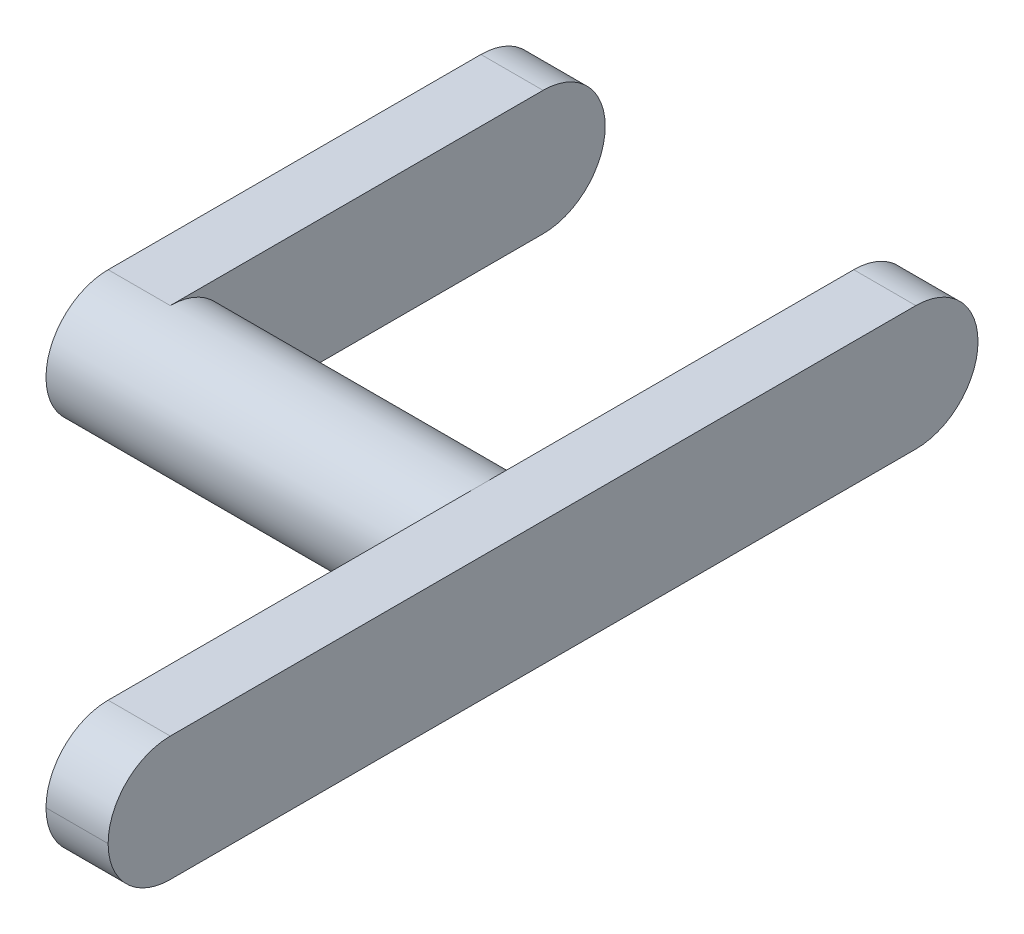
ISO-10303-21;
HEADER;
FILE_DESCRIPTION(('STEP AP214'),'2;1');
FILE_NAME('part.step','',(''),(''),'','','');
FILE_SCHEMA(('AUTOMOTIVE_DESIGN { 1 0 10303 214 1 1 1 1 }'));
ENDSEC;
DATA;
#1=APPLICATION_CONTEXT('core data for automotive mechanical design processes');
#2=APPLICATION_PROTOCOL_DEFINITION('international standard','automotive_design',2000,#1);
#3=PRODUCT_CONTEXT('',#1,'mechanical');
#4=PRODUCT('Part','Part','',(#3));
#5=PRODUCT_RELATED_PRODUCT_CATEGORY('part','',(#4));
#6=PRODUCT_DEFINITION_FORMATION('','',#4);
#7=PRODUCT_DEFINITION_CONTEXT('part definition',#1,'design');
#8=PRODUCT_DEFINITION('design','',#6,#7);
#9=PRODUCT_DEFINITION_SHAPE('','',#8);
#10=(LENGTH_UNIT() NAMED_UNIT(*) SI_UNIT(.MILLI.,.METRE.));
#11=(NAMED_UNIT(*) PLANE_ANGLE_UNIT() SI_UNIT($,.RADIAN.));
#12=(NAMED_UNIT(*) SI_UNIT($,.STERADIAN.) SOLID_ANGLE_UNIT());
#13=UNCERTAINTY_MEASURE_WITH_UNIT(LENGTH_MEASURE(1.E-05),#10,'distance_accuracy_value','');
#14=(GEOMETRIC_REPRESENTATION_CONTEXT(3) GLOBAL_UNCERTAINTY_ASSIGNED_CONTEXT((#13)) GLOBAL_UNIT_ASSIGNED_CONTEXT((#10,
#11,#12)) REPRESENTATION_CONTEXT('',''));
#15=CARTESIAN_POINT('',(0.,0.,0.));
#16=DIRECTION('',(0.,0.,1.));
#17=DIRECTION('',(1.,0.,0.));
#18=AXIS2_PLACEMENT_3D('',#15,#16,#17);
#19=CARTESIAN_POINT('',(0.,10.,0.));
#20=DIRECTION('',(1.,0.,0.));
#21=DIRECTION('',(0.,0.,-1.));
#22=AXIS2_PLACEMENT_3D('',#19,#20,#21);
#23=PLANE('',#22);
#24=CARTESIAN_POINT('',(0.,5.,-65.));
#25=DIRECTION('',(1.,0.,0.));
#26=DIRECTION('',(0.,0.,-1.));
#27=AXIS2_PLACEMENT_3D('',#24,#25,#26);
#28=CIRCLE('',#27,5.);
#29=CARTESIAN_POINT('',(0.,10.,-65.));
#30=VERTEX_POINT('',#29);
#31=CARTESIAN_POINT('',(0.,5.,-70.));
#32=VERTEX_POINT('',#31);
#33=EDGE_CURVE('E224',#30,#32,#28,.F.);
#34=ORIENTED_EDGE('',*,*,#33,.T.);
#35=CARTESIAN_POINT('',(0.,5.,-65.));
#36=DIRECTION('',(1.,0.,0.));
#37=DIRECTION('',(0.,0.,-1.));
#38=AXIS2_PLACEMENT_3D('',#35,#36,#37);
#39=CIRCLE('',#38,5.);
#40=CARTESIAN_POINT('',(0.,0.,-65.));
#41=VERTEX_POINT('',#40);
#42=EDGE_CURVE('E226',#32,#41,#39,.F.);
#43=ORIENTED_EDGE('',*,*,#42,.T.);
#44=DIRECTION('',(0.,0.,1.));
#45=VECTOR('',#44,1.);
#46=CARTESIAN_POINT('',(0.,0.,0.));
#47=LINE('',#46,#45);
#48=CARTESIAN_POINT('',(0.,0.,-35.));
#49=VERTEX_POINT('',#48);
#50=EDGE_CURVE('E219',#41,#49,#47,.T.);
#51=ORIENTED_EDGE('',*,*,#50,.T.);
#52=CARTESIAN_POINT('',(0.,5.,-35.));
#53=DIRECTION('',(-1.,0.,0.));
#54=DIRECTION('',(0.,0.,1.));
#55=AXIS2_PLACEMENT_3D('',#52,#53,#54);
#56=CIRCLE('',#55,5.);
#57=CARTESIAN_POINT('',(0.,10.,-35.));
#58=VERTEX_POINT('',#57);
#59=EDGE_CURVE('E177',#58,#49,#56,.T.);
#60=ORIENTED_EDGE('',*,*,#59,.F.);
#61=DIRECTION('',(0.,0.,1.));
#62=VECTOR('',#61,1.);
#63=CARTESIAN_POINT('',(0.,10.,0.));
#64=LINE('',#63,#62);
#65=EDGE_CURVE('E213',#30,#58,#64,.T.);
#66=ORIENTED_EDGE('',*,*,#65,.F.);
#67=EDGE_LOOP('',(#34,#43,#51,#60,#66));
#68=FACE_BOUND('',#67,.T.);
#69=ADVANCED_FACE('F35',(#68),#23,.F.);
#70=CARTESIAN_POINT('',(0.,0.,-5.));
#71=VERTEX_POINT('',#70);
#72=EDGE_CURVE('E206',#49,#71,#47,.T.);
#73=ORIENTED_EDGE('',*,*,#72,.T.);
#74=CARTESIAN_POINT('',(0.,5.,-5.));
#75=DIRECTION('',(1.,0.,0.));
#76=DIRECTION('',(0.,0.,-1.));
#77=AXIS2_PLACEMENT_3D('',#74,#75,#76);
#78=CIRCLE('',#77,5.);
#79=CARTESIAN_POINT('',(0.,5.,0.));
#80=VERTEX_POINT('',#79);
#81=EDGE_CURVE('E243',#71,#80,#78,.F.);
#82=ORIENTED_EDGE('',*,*,#81,.T.);
#83=CARTESIAN_POINT('',(0.,5.,-5.));
#84=DIRECTION('',(1.,0.,0.));
#85=DIRECTION('',(0.,0.,-1.));
#86=AXIS2_PLACEMENT_3D('',#83,#84,#85);
#87=CIRCLE('',#86,5.);
#88=CARTESIAN_POINT('',(0.,10.,-5.));
#89=VERTEX_POINT('',#88);
#90=EDGE_CURVE('E60',#80,#89,#87,.F.);
#91=ORIENTED_EDGE('',*,*,#90,.T.);
#92=EDGE_CURVE('E216',#58,#89,#64,.T.);
#93=ORIENTED_EDGE('',*,*,#92,.F.);
#94=EDGE_CURVE('E180',#49,#58,#56,.T.);
#95=ORIENTED_EDGE('',*,*,#94,.F.);
#96=EDGE_LOOP('',(#73,#82,#91,#93,#95));
#97=FACE_BOUND('',#96,.T.);
#98=DIRECTION('',(0.,-0.087295850286759,-0.99618243034231));
#99=VECTOR('',#98,1.);
#100=CARTESIAN_POINT('',(0.,8.88334864029896,-0.778451264877408));
#101=LINE('',#100,#99);
#102=CARTESIAN_POINT('',(0.,8.48663850619809,-5.30553547600365));
#103=VERTEX_POINT('',#102);
#104=CARTESIAN_POINT('',(0.,7.89999999999999,-12.));
#105=VERTEX_POINT('',#104);
#106=EDGE_CURVE('E196',#103,#105,#101,.T.);
#107=ORIENTED_EDGE('',*,*,#106,.F.);
#108=CARTESIAN_POINT('',(0.,5.,-5.));
#109=DIRECTION('',(-1.,0.,0.));
#110=DIRECTION('',(0.,0.,1.));
#111=AXIS2_PLACEMENT_3D('',#108,#109,#110);
#112=CIRCLE('',#111,3.5);
#113=CARTESIAN_POINT('',(0.,1.51336149380191,-5.30553547600364));
#114=VERTEX_POINT('',#113);
#115=EDGE_CURVE('E176',#114,#103,#112,.T.);
#116=ORIENTED_EDGE('',*,*,#115,.F.);
#117=DIRECTION('',(0.,-0.0872958502867559,0.99618243034231));
#118=VECTOR('',#117,1.);
#119=CARTESIAN_POINT('',(0.,1.04044570492818,0.0911746580972107));
#120=LINE('',#119,#118);
#121=CARTESIAN_POINT('',(0.,2.09999999999999,-12.));
#122=VERTEX_POINT('',#121);
#123=EDGE_CURVE('E185',#122,#114,#120,.T.);
#124=ORIENTED_EDGE('',*,*,#123,.F.);
#125=DIRECTION('',(0.,-1.,0.));
#126=VECTOR('',#125,1.);
#127=CARTESIAN_POINT('',(0.,0.,-12.));
#128=LINE('',#127,#126);
#129=EDGE_CURVE('E199',#105,#122,#128,.T.);
#130=ORIENTED_EDGE('',*,*,#129,.F.);
#131=EDGE_LOOP('',(#107,#116,#124,#130));
#132=FACE_BOUND('',#131,.T.);
#133=ADVANCED_FACE('F276',(#97,#132),#23,.F.);
#134=CARTESIAN_POINT('',(5.,10.,0.));
#135=DIRECTION('',(-1.,0.,0.));
#136=DIRECTION('',(0.,0.,1.));
#137=AXIS2_PLACEMENT_3D('',#134,#135,#136);
#138=PLANE('',#137);
#139=CARTESIAN_POINT('',(5.,5.,-5.));
#140=DIRECTION('',(-1.,0.,0.));
#141=DIRECTION('',(0.,0.,1.));
#142=AXIS2_PLACEMENT_3D('',#139,#140,#141);
#143=CIRCLE('',#142,5.);
#144=CARTESIAN_POINT('',(5.,10.,-5.));
#145=VERTEX_POINT('',#144);
#146=CARTESIAN_POINT('',(5.,5.,0.));
#147=VERTEX_POINT('',#146);
#148=EDGE_CURVE('E238',#145,#147,#143,.F.);
#149=ORIENTED_EDGE('',*,*,#148,.T.);
#150=CARTESIAN_POINT('',(5.,5.,-5.));
#151=DIRECTION('',(-1.,0.,0.));
#152=DIRECTION('',(0.,0.,1.));
#153=AXIS2_PLACEMENT_3D('',#150,#151,#152);
#154=CIRCLE('',#153,5.);
#155=CARTESIAN_POINT('',(5.,0.,-5.));
#156=VERTEX_POINT('',#155);
#157=EDGE_CURVE('E240',#147,#156,#154,.F.);
#158=ORIENTED_EDGE('',*,*,#157,.T.);
#159=DIRECTION('',(0.,0.,-1.));
#160=VECTOR('',#159,1.);
#161=CARTESIAN_POINT('',(5.,0.,0.));
#162=LINE('',#161,#160);
#163=CARTESIAN_POINT('',(5.,0.,-65.));
#164=VERTEX_POINT('',#163);
#165=EDGE_CURVE('E221',#156,#164,#162,.T.);
#166=ORIENTED_EDGE('',*,*,#165,.T.);
#167=CARTESIAN_POINT('',(5.,5.,-65.));
#168=DIRECTION('',(-1.,0.,0.));
#169=DIRECTION('',(0.,0.,1.));
#170=AXIS2_PLACEMENT_3D('',#167,#168,#169);
#171=CIRCLE('',#170,5.);
#172=CARTESIAN_POINT('',(5.,5.,-70.));
#173=VERTEX_POINT('',#172);
#174=EDGE_CURVE('E236',#164,#173,#171,.F.);
#175=ORIENTED_EDGE('',*,*,#174,.T.);
#176=CARTESIAN_POINT('',(5.,5.,-65.));
#177=DIRECTION('',(-1.,0.,0.));
#178=DIRECTION('',(0.,0.,1.));
#179=AXIS2_PLACEMENT_3D('',#176,#177,#178);
#180=CIRCLE('',#179,5.);
#181=CARTESIAN_POINT('',(5.,10.,-65.));
#182=VERTEX_POINT('',#181);
#183=EDGE_CURVE('E234',#173,#182,#180,.F.);
#184=ORIENTED_EDGE('',*,*,#183,.T.);
#185=DIRECTION('',(0.,0.,-1.));
#186=VECTOR('',#185,1.);
#187=CARTESIAN_POINT('',(5.,10.,0.));
#188=LINE('',#187,#186);
#189=EDGE_CURVE('E215',#145,#182,#188,.T.);
#190=ORIENTED_EDGE('',*,*,#189,.F.);
#191=EDGE_LOOP('',(#149,#158,#166,#175,#184,#190));
#192=FACE_BOUND('',#191,.T.);
#193=ADVANCED_FACE('F258',(#192),#138,.F.);
#194=CARTESIAN_POINT('',(0.,10.,0.));
#195=DIRECTION('',(0.,-1.,0.));
#196=DIRECTION('',(0.,0.,-1.));
#197=AXIS2_PLACEMENT_3D('',#194,#195,#196);
#198=PLANE('',#197);
#199=ORIENTED_EDGE('',*,*,#92,.T.);
#200=DIRECTION('',(1.,0.,0.));
#201=VECTOR('',#200,1.);
#202=CARTESIAN_POINT('',(0.,10.,-5.));
#203=LINE('',#202,#201);
#204=EDGE_CURVE('E11',#89,#145,#203,.T.);
#205=ORIENTED_EDGE('',*,*,#204,.T.);
#206=ORIENTED_EDGE('',*,*,#189,.T.);
#207=DIRECTION('',(-1.,0.,0.));
#208=VECTOR('',#207,1.);
#209=CARTESIAN_POINT('',(0.,10.,-65.));
#210=LINE('',#209,#208);
#211=EDGE_CURVE('E44',#182,#30,#210,.T.);
#212=ORIENTED_EDGE('',*,*,#211,.T.);
#213=ORIENTED_EDGE('',*,*,#65,.T.);
#214=EDGE_LOOP('',(#199,#205,#206,#212,#213));
#215=FACE_BOUND('',#214,.T.);
#216=ADVANCED_FACE('F261',(#215),#198,.F.);
#217=CARTESIAN_POINT('',(0.,0.,0.));
#218=DIRECTION('',(0.,-1.,0.));
#219=DIRECTION('',(0.,0.,-1.));
#220=AXIS2_PLACEMENT_3D('',#217,#218,#219);
#221=PLANE('',#220);
#222=ORIENTED_EDGE('',*,*,#50,.F.);
#223=DIRECTION('',(-1.,0.,0.));
#224=VECTOR('',#223,1.);
#225=CARTESIAN_POINT('',(5.,0.,-65.));
#226=LINE('',#225,#224);
#227=EDGE_CURVE('E231',#41,#164,#226,.F.);
#228=ORIENTED_EDGE('',*,*,#227,.T.);
#229=ORIENTED_EDGE('',*,*,#165,.F.);
#230=DIRECTION('',(1.,0.,0.));
#231=VECTOR('',#230,1.);
#232=CARTESIAN_POINT('',(0.,0.,-5.));
#233=LINE('',#232,#231);
#234=EDGE_CURVE('E228',#156,#71,#233,.F.);
#235=ORIENTED_EDGE('',*,*,#234,.T.);
#236=ORIENTED_EDGE('',*,*,#72,.F.);
#237=EDGE_LOOP('',(#222,#228,#229,#235,#236));
#238=FACE_BOUND('',#237,.T.);
#239=ADVANCED_FACE('F272',(#238),#221,.T.);
#240=CARTESIAN_POINT('',(3.5,5.,-5.));
#241=DIRECTION('',(-1.,0.,0.));
#242=DIRECTION('',(0.,0.,1.));
#243=AXIS2_PLACEMENT_3D('',#240,#241,#242);
#244=CYLINDRICAL_SURFACE('',#243,3.5);
#245=ORIENTED_EDGE('',*,*,#115,.T.);
#246=DIRECTION('',(-1.,0.,0.));
#247=VECTOR('',#246,1.);
#248=CARTESIAN_POINT('',(3.5,8.48663850619809,-5.30553547600364));
#249=LINE('',#248,#247);
#250=CARTESIAN_POINT('',(3.5,8.48663850619809,-5.30553547600364));
#251=VERTEX_POINT('',#250);
#252=EDGE_CURVE('E194',#251,#103,#249,.T.);
#253=ORIENTED_EDGE('',*,*,#252,.F.);
#254=CARTESIAN_POINT('',(3.5,5.,-5.));
#255=DIRECTION('',(-1.,0.,0.));
#256=DIRECTION('',(0.,0.,1.));
#257=AXIS2_PLACEMENT_3D('',#254,#255,#256);
#258=CIRCLE('',#257,3.5);
#259=CARTESIAN_POINT('',(3.5,1.51336149380191,-5.30553547600364));
#260=VERTEX_POINT('',#259);
#261=EDGE_CURVE('E181',#260,#251,#258,.T.);
#262=ORIENTED_EDGE('',*,*,#261,.F.);
#263=DIRECTION('',(-1.,0.,0.));
#264=VECTOR('',#263,1.);
#265=CARTESIAN_POINT('',(3.5,1.51336149380191,-5.30553547600364));
#266=LINE('',#265,#264);
#267=EDGE_CURVE('E204',#260,#114,#266,.T.);
#268=ORIENTED_EDGE('',*,*,#267,.T.);
#269=EDGE_LOOP('',(#245,#253,#262,#268));
#270=FACE_BOUND('',#269,.T.);
#271=ADVANCED_FACE('F349',(#270),#244,.F.);
#272=CARTESIAN_POINT('',(3.5,1.04044570492818,0.0911746580972107));
#273=DIRECTION('',(0.,-0.99618243034231,-0.0872958502867559));
#274=DIRECTION('',(0.,0.0872958502867559,-0.99618243034231));
#275=AXIS2_PLACEMENT_3D('',#272,#273,#274);
#276=PLANE('',#275);
#277=ORIENTED_EDGE('',*,*,#123,.T.);
#278=ORIENTED_EDGE('',*,*,#267,.F.);
#279=DIRECTION('',(0.,-0.0872958502867559,0.99618243034231));
#280=VECTOR('',#279,1.);
#281=CARTESIAN_POINT('',(3.5,1.04044570492818,0.0911746580972107));
#282=LINE('',#281,#280);
#283=CARTESIAN_POINT('',(3.5,2.09999999999999,-12.));
#284=VERTEX_POINT('',#283);
#285=EDGE_CURVE('E191',#284,#260,#282,.T.);
#286=ORIENTED_EDGE('',*,*,#285,.F.);
#287=DIRECTION('',(-1.,0.,0.));
#288=VECTOR('',#287,1.);
#289=CARTESIAN_POINT('',(3.5,2.09999999999999,-12.));
#290=LINE('',#289,#288);
#291=EDGE_CURVE('E207',#284,#122,#290,.T.);
#292=ORIENTED_EDGE('',*,*,#291,.T.);
#293=EDGE_LOOP('',(#277,#278,#286,#292));
#294=FACE_BOUND('',#293,.T.);
#295=ADVANCED_FACE('F341',(#294),#276,.F.);
#296=CARTESIAN_POINT('',(3.5,0.,-12.));
#297=DIRECTION('',(0.,0.,-1.));
#298=DIRECTION('',(-1.,0.,0.));
#299=AXIS2_PLACEMENT_3D('',#296,#297,#298);
#300=PLANE('',#299);
#301=ORIENTED_EDGE('',*,*,#129,.T.);
#302=ORIENTED_EDGE('',*,*,#291,.F.);
#303=DIRECTION('',(0.,-1.,0.));
#304=VECTOR('',#303,1.);
#305=CARTESIAN_POINT('',(3.5,0.,-12.));
#306=LINE('',#305,#304);
#307=CARTESIAN_POINT('',(3.5,7.89999999999999,-12.));
#308=VERTEX_POINT('',#307);
#309=EDGE_CURVE('E188',#308,#284,#306,.T.);
#310=ORIENTED_EDGE('',*,*,#309,.F.);
#311=DIRECTION('',(-1.,0.,0.));
#312=VECTOR('',#311,1.);
#313=CARTESIAN_POINT('',(3.5,7.89999999999999,-12.));
#314=LINE('',#313,#312);
#315=EDGE_CURVE('E209',#308,#105,#314,.T.);
#316=ORIENTED_EDGE('',*,*,#315,.T.);
#317=EDGE_LOOP('',(#301,#302,#310,#316));
#318=FACE_BOUND('',#317,.T.);
#319=ADVANCED_FACE('F333',(#318),#300,.F.);
#320=CARTESIAN_POINT('',(3.5,8.88334864029896,-0.778451264877408));
#321=DIRECTION('',(0.,0.99618243034231,-0.087295850286759));
#322=DIRECTION('',(0.,0.087295850286759,0.99618243034231));
#323=AXIS2_PLACEMENT_3D('',#320,#321,#322);
#324=PLANE('',#323);
#325=ORIENTED_EDGE('',*,*,#106,.T.);
#326=ORIENTED_EDGE('',*,*,#315,.F.);
#327=DIRECTION('',(0.,-0.087295850286759,-0.99618243034231));
#328=VECTOR('',#327,1.);
#329=CARTESIAN_POINT('',(3.5,8.88334864029896,-0.778451264877408));
#330=LINE('',#329,#328);
#331=EDGE_CURVE('E184',#251,#308,#330,.T.);
#332=ORIENTED_EDGE('',*,*,#331,.F.);
#333=ORIENTED_EDGE('',*,*,#252,.T.);
#334=EDGE_LOOP('',(#325,#326,#332,#333));
#335=FACE_BOUND('',#334,.T.);
#336=ADVANCED_FACE('F325',(#335),#324,.F.);
#337=CARTESIAN_POINT('',(3.5,0.,0.));
#338=DIRECTION('',(-1.,0.,0.));
#339=DIRECTION('',(0.,0.,1.));
#340=AXIS2_PLACEMENT_3D('',#337,#338,#339);
#341=PLANE('',#340);
#342=ORIENTED_EDGE('',*,*,#261,.T.);
#343=ORIENTED_EDGE('',*,*,#331,.T.);
#344=ORIENTED_EDGE('',*,*,#309,.T.);
#345=ORIENTED_EDGE('',*,*,#285,.T.);
#346=EDGE_LOOP('',(#342,#343,#344,#345));
#347=FACE_BOUND('',#346,.T.);
#348=ADVANCED_FACE('F317',(#347),#341,.T.);
#349=CARTESIAN_POINT('',(-25.,5.,-35.));
#350=DIRECTION('',(1.,0.,0.));
#351=DIRECTION('',(0.,0.,-1.));
#352=AXIS2_PLACEMENT_3D('',#349,#350,#351);
#353=CYLINDRICAL_SURFACE('',#352,5.);
#354=CARTESIAN_POINT('',(-25.,5.,-35.));
#355=DIRECTION('',(-1.,0.,0.));
#356=DIRECTION('',(0.,0.,1.));
#357=AXIS2_PLACEMENT_3D('',#354,#355,#356);
#358=CIRCLE('',#357,5.);
#359=CARTESIAN_POINT('',(-25.,10.,-35.));
#360=VERTEX_POINT('',#359);
#361=CARTESIAN_POINT('',(-25.,0.,-35.));
#362=VERTEX_POINT('',#361);
#363=EDGE_CURVE('E52',#360,#362,#358,.T.);
#364=ORIENTED_EDGE('',*,*,#363,.F.);
#365=DIRECTION('',(1.,0.,0.));
#366=VECTOR('',#365,1.);
#367=CARTESIAN_POINT('',(-30.,10.,-35.));
#368=LINE('',#367,#366);
#369=CARTESIAN_POINT('',(-30.,10.,-35.));
#370=VERTEX_POINT('',#369);
#371=EDGE_CURVE('E149',#370,#360,#368,.T.);
#372=ORIENTED_EDGE('',*,*,#371,.F.);
#373=CARTESIAN_POINT('',(-30.,5.,-35.));
#374=DIRECTION('',(-1.,0.,0.));
#375=DIRECTION('',(0.,0.,1.));
#376=AXIS2_PLACEMENT_3D('',#373,#374,#375);
#377=CIRCLE('',#376,5.);
#378=CARTESIAN_POINT('',(-30.,0.,-35.));
#379=VERTEX_POINT('',#378);
#380=EDGE_CURVE('E155',#379,#370,#377,.T.);
#381=ORIENTED_EDGE('',*,*,#380,.F.);
#382=DIRECTION('',(1.,0.,0.));
#383=VECTOR('',#382,1.);
#384=CARTESIAN_POINT('',(-30.,0.,-35.));
#385=LINE('',#384,#383);
#386=EDGE_CURVE('E445',#379,#362,#385,.T.);
#387=ORIENTED_EDGE('',*,*,#386,.T.);
#388=EDGE_LOOP('',(#364,#372,#381,#387));
#389=FACE_BOUND('',#388,.T.);
#390=ORIENTED_EDGE('',*,*,#59,.T.);
#391=ORIENTED_EDGE('',*,*,#94,.T.);
#392=EDGE_LOOP('',(#390,#391));
#393=FACE_BOUND('',#392,.T.);
#394=ADVANCED_FACE('F166',(#389,#393),#353,.T.);
#395=CARTESIAN_POINT('',(0.,5.,-65.));
#396=DIRECTION('',(-1.,0.,0.));
#397=DIRECTION('',(0.,0.,1.));
#398=AXIS2_PLACEMENT_3D('',#395,#396,#397);
#399=CYLINDRICAL_SURFACE('',#398,5.);
#400=ORIENTED_EDGE('',*,*,#211,.F.);
#401=ORIENTED_EDGE('',*,*,#183,.F.);
#402=DIRECTION('',(-1.,0.,0.));
#403=VECTOR('',#402,1.);
#404=CARTESIAN_POINT('',(0.,5.,-70.));
#405=LINE('',#404,#403);
#406=EDGE_CURVE('E170',#32,#173,#405,.F.);
#407=ORIENTED_EDGE('',*,*,#406,.F.);
#408=ORIENTED_EDGE('',*,*,#33,.F.);
#409=EDGE_LOOP('',(#400,#401,#407,#408));
#410=FACE_BOUND('',#409,.T.);
#411=ADVANCED_FACE('F255',(#410),#399,.T.);
#412=CARTESIAN_POINT('',(0.,5.,-65.));
#413=DIRECTION('',(1.,0.,0.));
#414=DIRECTION('',(0.,0.,-1.));
#415=AXIS2_PLACEMENT_3D('',#412,#413,#414);
#416=CYLINDRICAL_SURFACE('',#415,5.);
#417=ORIENTED_EDGE('',*,*,#174,.F.);
#418=ORIENTED_EDGE('',*,*,#227,.F.);
#419=ORIENTED_EDGE('',*,*,#42,.F.);
#420=ORIENTED_EDGE('',*,*,#406,.T.);
#421=EDGE_LOOP('',(#417,#418,#419,#420));
#422=FACE_BOUND('',#421,.T.);
#423=ADVANCED_FACE('F249',(#422),#416,.T.);
#424=CARTESIAN_POINT('',(0.,5.,-5.));
#425=DIRECTION('',(1.,0.,0.));
#426=DIRECTION('',(0.,0.,-1.));
#427=AXIS2_PLACEMENT_3D('',#424,#425,#426);
#428=CYLINDRICAL_SURFACE('',#427,5.);
#429=ORIENTED_EDGE('',*,*,#204,.F.);
#430=ORIENTED_EDGE('',*,*,#90,.F.);
#431=DIRECTION('',(1.,0.,0.));
#432=VECTOR('',#431,1.);
#433=CARTESIAN_POINT('',(0.,5.,0.));
#434=LINE('',#433,#432);
#435=EDGE_CURVE('E39',#147,#80,#434,.F.);
#436=ORIENTED_EDGE('',*,*,#435,.F.);
#437=ORIENTED_EDGE('',*,*,#148,.F.);
#438=EDGE_LOOP('',(#429,#430,#436,#437));
#439=FACE_BOUND('',#438,.T.);
#440=ADVANCED_FACE('F37',(#439),#428,.T.);
#441=CARTESIAN_POINT('',(0.,5.,-5.));
#442=DIRECTION('',(-1.,0.,0.));
#443=DIRECTION('',(0.,0.,1.));
#444=AXIS2_PLACEMENT_3D('',#441,#442,#443);
#445=CYLINDRICAL_SURFACE('',#444,5.);
#446=ORIENTED_EDGE('',*,*,#81,.F.);
#447=ORIENTED_EDGE('',*,*,#234,.F.);
#448=ORIENTED_EDGE('',*,*,#157,.F.);
#449=ORIENTED_EDGE('',*,*,#435,.T.);
#450=EDGE_LOOP('',(#446,#447,#448,#449));
#451=FACE_BOUND('',#450,.T.);
#452=ADVANCED_FACE('F275',(#451),#445,.T.);
#453=CARTESIAN_POINT('',(-25.,5.,-35.));
#454=DIRECTION('',(-1.,0.,0.));
#455=DIRECTION('',(0.,0.,1.));
#456=AXIS2_PLACEMENT_3D('',#453,#454,#455);
#457=PLANE('',#456);
#458=DIRECTION('',(0.,0.,-1.));
#459=VECTOR('',#458,1.);
#460=CARTESIAN_POINT('',(-25.,10.,-35.));
#461=LINE('',#460,#459);
#462=CARTESIAN_POINT('',(-25.,9.99999999999999,-65.));
#463=VERTEX_POINT('',#462);
#464=EDGE_CURVE('E454',#360,#463,#461,.T.);
#465=ORIENTED_EDGE('',*,*,#464,.F.);
#466=ORIENTED_EDGE('',*,*,#363,.T.);
#467=DIRECTION('',(0.,0.,1.));
#468=VECTOR('',#467,1.);
#469=CARTESIAN_POINT('',(-25.,0.,-35.));
#470=LINE('',#469,#468);
#471=CARTESIAN_POINT('',(-25.,0.,-65.));
#472=VERTEX_POINT('',#471);
#473=EDGE_CURVE('E164',#472,#362,#470,.T.);
#474=ORIENTED_EDGE('',*,*,#473,.F.);
#475=CARTESIAN_POINT('',(-25.,5.,-65.));
#476=DIRECTION('',(-1.,0.,0.));
#477=DIRECTION('',(0.,0.,1.));
#478=AXIS2_PLACEMENT_3D('',#475,#476,#477);
#479=CIRCLE('',#478,4.99999999999999);
#480=EDGE_CURVE('E448',#463,#472,#479,.T.);
#481=ORIENTED_EDGE('',*,*,#480,.F.);
#482=EDGE_LOOP('',(#465,#466,#474,#481));
#483=FACE_BOUND('',#482,.T.);
#484=ADVANCED_FACE('F294',(#483),#457,.F.);
#485=CARTESIAN_POINT('',(-30.,10.,-35.));
#486=DIRECTION('',(0.,-1.,0.));
#487=DIRECTION('',(0.,0.,-1.));
#488=AXIS2_PLACEMENT_3D('',#485,#486,#487);
#489=PLANE('',#488);
#490=ORIENTED_EDGE('',*,*,#464,.T.);
#491=DIRECTION('',(1.,0.,0.));
#492=VECTOR('',#491,1.);
#493=CARTESIAN_POINT('',(-30.,9.99999999999999,-65.));
#494=LINE('',#493,#492);
#495=CARTESIAN_POINT('',(-30.,9.99999999999999,-65.));
#496=VERTEX_POINT('',#495);
#497=EDGE_CURVE('E151',#496,#463,#494,.T.);
#498=ORIENTED_EDGE('',*,*,#497,.F.);
#499=DIRECTION('',(0.,0.,-1.));
#500=VECTOR('',#499,1.);
#501=CARTESIAN_POINT('',(-30.,10.,-35.));
#502=LINE('',#501,#500);
#503=EDGE_CURVE('E145',#370,#496,#502,.T.);
#504=ORIENTED_EDGE('',*,*,#503,.F.);
#505=ORIENTED_EDGE('',*,*,#371,.T.);
#506=EDGE_LOOP('',(#490,#498,#504,#505));
#507=FACE_BOUND('',#506,.T.);
#508=ADVANCED_FACE('F147',(#507),#489,.F.);
#509=CARTESIAN_POINT('',(-30.,5.,-65.));
#510=DIRECTION('',(1.,0.,0.));
#511=DIRECTION('',(0.,0.,-1.));
#512=AXIS2_PLACEMENT_3D('',#509,#510,#511);
#513=CYLINDRICAL_SURFACE('',#512,4.99999999999999);
#514=ORIENTED_EDGE('',*,*,#480,.T.);
#515=DIRECTION('',(1.,0.,0.));
#516=VECTOR('',#515,1.);
#517=CARTESIAN_POINT('',(-30.,0.,-65.));
#518=LINE('',#517,#516);
#519=CARTESIAN_POINT('',(-30.,0.,-65.));
#520=VERTEX_POINT('',#519);
#521=EDGE_CURVE('E171',#520,#472,#518,.T.);
#522=ORIENTED_EDGE('',*,*,#521,.F.);
#523=CARTESIAN_POINT('',(-30.,5.,-65.));
#524=DIRECTION('',(-1.,0.,0.));
#525=DIRECTION('',(0.,0.,1.));
#526=AXIS2_PLACEMENT_3D('',#523,#524,#525);
#527=CIRCLE('',#526,4.99999999999999);
#528=EDGE_CURVE('E154',#496,#520,#527,.T.);
#529=ORIENTED_EDGE('',*,*,#528,.F.);
#530=ORIENTED_EDGE('',*,*,#497,.T.);
#531=EDGE_LOOP('',(#514,#522,#529,#530));
#532=FACE_BOUND('',#531,.T.);
#533=ADVANCED_FACE('F413',(#532),#513,.T.);
#534=CARTESIAN_POINT('',(-30.,0.,-35.));
#535=DIRECTION('',(0.,1.,0.));
#536=DIRECTION('',(0.,0.,1.));
#537=AXIS2_PLACEMENT_3D('',#534,#535,#536);
#538=PLANE('',#537);
#539=ORIENTED_EDGE('',*,*,#473,.T.);
#540=ORIENTED_EDGE('',*,*,#386,.F.);
#541=DIRECTION('',(0.,0.,1.));
#542=VECTOR('',#541,1.);
#543=CARTESIAN_POINT('',(-30.,0.,-35.));
#544=LINE('',#543,#542);
#545=EDGE_CURVE('E160',#520,#379,#544,.T.);
#546=ORIENTED_EDGE('',*,*,#545,.F.);
#547=ORIENTED_EDGE('',*,*,#521,.T.);
#548=EDGE_LOOP('',(#539,#540,#546,#547));
#549=FACE_BOUND('',#548,.T.);
#550=ADVANCED_FACE('F421',(#549),#538,.F.);
#551=CARTESIAN_POINT('',(-30.,5.,-35.));
#552=DIRECTION('',(-1.,0.,0.));
#553=DIRECTION('',(0.,0.,1.));
#554=AXIS2_PLACEMENT_3D('',#551,#552,#553);
#555=PLANE('',#554);
#556=ORIENTED_EDGE('',*,*,#380,.T.);
#557=ORIENTED_EDGE('',*,*,#503,.T.);
#558=ORIENTED_EDGE('',*,*,#528,.T.);
#559=ORIENTED_EDGE('',*,*,#545,.T.);
#560=EDGE_LOOP('',(#556,#557,#558,#559));
#561=FACE_BOUND('',#560,.T.);
#562=ADVANCED_FACE('F158',(#561),#555,.T.);
#563=CLOSED_SHELL('',(#69,#133,#193,#216,#239,#271,#295,#319,#336,#348,#394,#411,#423,#440,#452,
#484,#508,#533,#550,#562));
#564=MANIFOLD_SOLID_BREP('B2',#563);
#565=ADVANCED_BREP_SHAPE_REPRESENTATION('',(#18,#564),#14);
#566=SHAPE_DEFINITION_REPRESENTATION(#9,#565);
ENDSEC;
END-ISO-10303-21;
